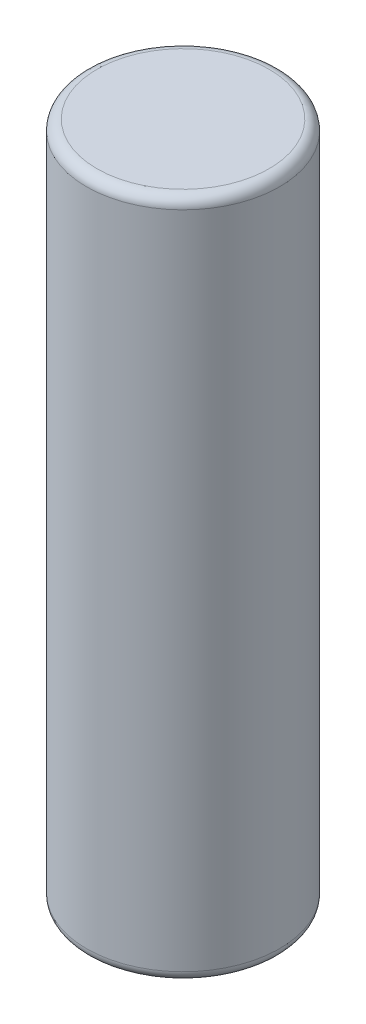
ISO-10303-21;
HEADER;
FILE_DESCRIPTION(('STEP AP214'),'2;1');
FILE_NAME('part.step','',(''),(''),'','','');
FILE_SCHEMA(('AUTOMOTIVE_DESIGN { 1 0 10303 214 1 1 1 1 }'));
ENDSEC;
DATA;
#1=APPLICATION_CONTEXT('core data for automotive mechanical design processes');
#2=APPLICATION_PROTOCOL_DEFINITION('international standard','automotive_design',2000,#1);
#3=PRODUCT_CONTEXT('',#1,'mechanical');
#4=PRODUCT('Part','Part','',(#3));
#5=PRODUCT_RELATED_PRODUCT_CATEGORY('part','',(#4));
#6=PRODUCT_DEFINITION_FORMATION('','',#4);
#7=PRODUCT_DEFINITION_CONTEXT('part definition',#1,'design');
#8=PRODUCT_DEFINITION('design','',#6,#7);
#9=PRODUCT_DEFINITION_SHAPE('','',#8);
#10=(LENGTH_UNIT() NAMED_UNIT(*) SI_UNIT(.MILLI.,.METRE.));
#11=(NAMED_UNIT(*) PLANE_ANGLE_UNIT() SI_UNIT($,.RADIAN.));
#12=(NAMED_UNIT(*) SI_UNIT($,.STERADIAN.) SOLID_ANGLE_UNIT());
#13=UNCERTAINTY_MEASURE_WITH_UNIT(LENGTH_MEASURE(1.E-05),#10,'distance_accuracy_value','');
#14=(GEOMETRIC_REPRESENTATION_CONTEXT(3) GLOBAL_UNCERTAINTY_ASSIGNED_CONTEXT((#13)) GLOBAL_UNIT_ASSIGNED_CONTEXT((#10,
#11,#12)) REPRESENTATION_CONTEXT('',''));
#15=CARTESIAN_POINT('',(0.,0.,0.));
#16=DIRECTION('',(0.,0.,1.));
#17=DIRECTION('',(1.,0.,0.));
#18=AXIS2_PLACEMENT_3D('',#15,#16,#17);
#19=CARTESIAN_POINT('',(0.,65.2,0.));
#20=DIRECTION('',(0.,-1.,0.));
#21=DIRECTION('',(0.,0.,-1.));
#22=AXIS2_PLACEMENT_3D('',#19,#20,#21);
#23=CYLINDRICAL_SURFACE('',#22,9.25);
#24=CARTESIAN_POINT('',(0.,1.,0.));
#25=DIRECTION('',(0.,1.,0.));
#26=DIRECTION('',(0.,0.,1.));
#27=AXIS2_PLACEMENT_3D('',#24,#25,#26);
#28=CIRCLE('',#27,9.25);
#29=CARTESIAN_POINT('',(0.,1.,9.25));
#30=VERTEX_POINT('',#29);
#31=EDGE_CURVE('E45',#30,#30,#28,.T.);
#32=ORIENTED_EDGE('',*,*,#31,.T.);
#33=EDGE_LOOP('',(#32));
#34=FACE_BOUND('',#33,.T.);
#35=CARTESIAN_POINT('',(0.,64.2,0.));
#36=DIRECTION('',(0.,1.,0.));
#37=DIRECTION('',(0.,0.,1.));
#38=AXIS2_PLACEMENT_3D('',#35,#36,#37);
#39=CIRCLE('',#38,9.25);
#40=CARTESIAN_POINT('',(0.,64.2,9.25));
#41=VERTEX_POINT('',#40);
#42=EDGE_CURVE('E49',#41,#41,#39,.F.);
#43=ORIENTED_EDGE('',*,*,#42,.T.);
#44=EDGE_LOOP('',(#43));
#45=FACE_BOUND('',#44,.T.);
#46=ADVANCED_FACE('F34',(#34,#45),#23,.T.);
#47=CARTESIAN_POINT('',(0.,65.2,0.));
#48=DIRECTION('',(0.,1.,0.));
#49=DIRECTION('',(0.,0.,1.));
#50=AXIS2_PLACEMENT_3D('',#47,#48,#49);
#51=PLANE('',#50);
#52=CARTESIAN_POINT('',(0.,65.2,0.));
#53=DIRECTION('',(0.,1.,0.));
#54=DIRECTION('',(0.,0.,1.));
#55=AXIS2_PLACEMENT_3D('',#52,#53,#54);
#56=CIRCLE('',#55,8.25);
#57=CARTESIAN_POINT('',(0.,65.2,8.25));
#58=VERTEX_POINT('',#57);
#59=EDGE_CURVE('E10',#58,#58,#56,.T.);
#60=ORIENTED_EDGE('',*,*,#59,.T.);
#61=EDGE_LOOP('',(#60));
#62=FACE_BOUND('',#61,.T.);
#63=ADVANCED_FACE('F65',(#62),#51,.T.);
#64=CARTESIAN_POINT('',(0.,0.,0.));
#65=DIRECTION('',(0.,1.,0.));
#66=DIRECTION('',(0.,0.,1.));
#67=AXIS2_PLACEMENT_3D('',#64,#65,#66);
#68=PLANE('',#67);
#69=CARTESIAN_POINT('',(0.,0.,0.));
#70=DIRECTION('',(0.,1.,0.));
#71=DIRECTION('',(0.,0.,1.));
#72=AXIS2_PLACEMENT_3D('',#69,#70,#71);
#73=CIRCLE('',#72,8.25);
#74=CARTESIAN_POINT('',(0.,0.,8.25));
#75=VERTEX_POINT('',#74);
#76=EDGE_CURVE('E41',#75,#75,#73,.F.);
#77=ORIENTED_EDGE('',*,*,#76,.T.);
#78=EDGE_LOOP('',(#77));
#79=FACE_BOUND('',#78,.T.);
#80=ADVANCED_FACE('F62',(#79),#68,.F.);
#81=CARTESIAN_POINT('',(0.,1.,0.));
#82=DIRECTION('',(0.,1.,0.));
#83=DIRECTION('',(0.,0.,1.));
#84=AXIS2_PLACEMENT_3D('',#81,#82,#83);
#85=TOROIDAL_SURFACE('',#84,8.25,1.);
#86=ORIENTED_EDGE('',*,*,#76,.F.);
#87=EDGE_LOOP('',(#86));
#88=FACE_BOUND('',#87,.T.);
#89=ORIENTED_EDGE('',*,*,#31,.F.);
#90=EDGE_LOOP('',(#89));
#91=FACE_BOUND('',#90,.T.);
#92=ADVANCED_FACE('F58',(#88,#91),#85,.T.);
#93=CARTESIAN_POINT('',(0.,64.2,0.));
#94=DIRECTION('',(0.,1.,0.));
#95=DIRECTION('',(0.,0.,1.));
#96=AXIS2_PLACEMENT_3D('',#93,#94,#95);
#97=TOROIDAL_SURFACE('',#96,8.25,1.);
#98=ORIENTED_EDGE('',*,*,#42,.F.);
#99=EDGE_LOOP('',(#98));
#100=FACE_BOUND('',#99,.T.);
#101=ORIENTED_EDGE('',*,*,#59,.F.);
#102=EDGE_LOOP('',(#101));
#103=FACE_BOUND('',#102,.T.);
#104=ADVANCED_FACE('F36',(#100,#103),#97,.T.);
#105=CLOSED_SHELL('',(#46,#63,#80,#92,#104));
#106=MANIFOLD_SOLID_BREP('B2',#105);
#107=ADVANCED_BREP_SHAPE_REPRESENTATION('',(#18,#106),#14);
#108=SHAPE_DEFINITION_REPRESENTATION(#9,#107);
ENDSEC;
END-ISO-10303-21;
